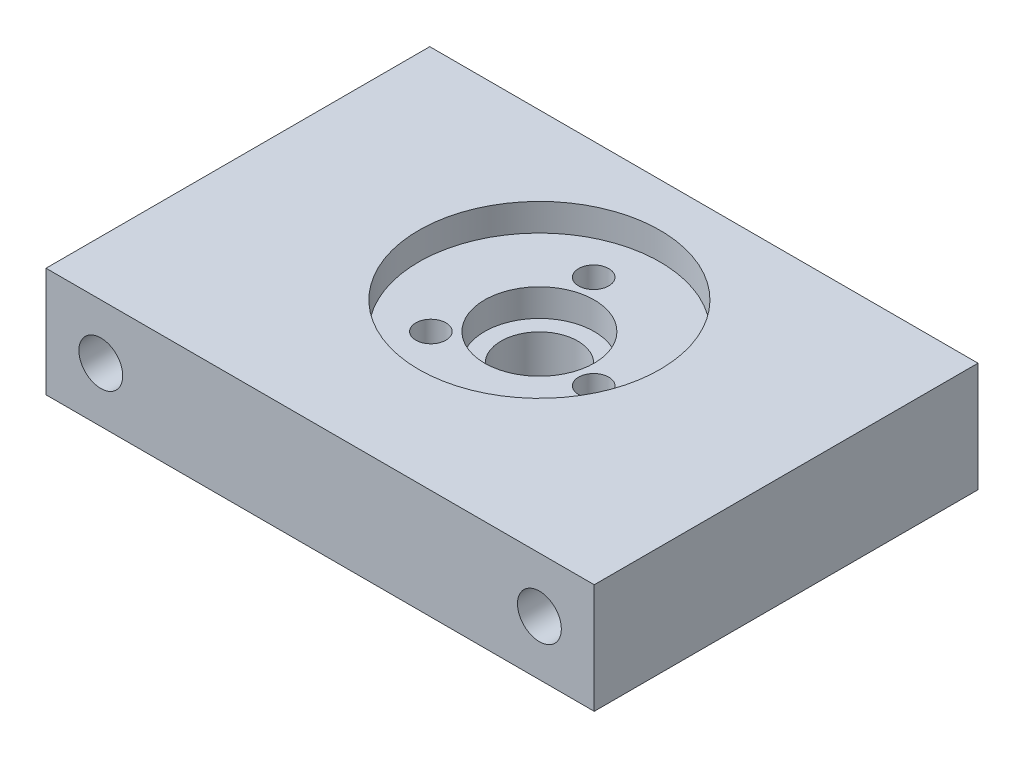
ISO-10303-21;
HEADER;
FILE_DESCRIPTION(('STEP AP214'),'2;1');
FILE_NAME('part.step','',(''),(''),'','','');
FILE_SCHEMA(('AUTOMOTIVE_DESIGN { 1 0 10303 214 1 1 1 1 }'));
ENDSEC;
DATA;
#1=APPLICATION_CONTEXT('core data for automotive mechanical design processes');
#2=APPLICATION_PROTOCOL_DEFINITION('international standard','automotive_design',2000,#1);
#3=PRODUCT_CONTEXT('',#1,'mechanical');
#4=PRODUCT('Part','Part','',(#3));
#5=PRODUCT_RELATED_PRODUCT_CATEGORY('part','',(#4));
#6=PRODUCT_DEFINITION_FORMATION('','',#4);
#7=PRODUCT_DEFINITION_CONTEXT('part definition',#1,'design');
#8=PRODUCT_DEFINITION('design','',#6,#7);
#9=PRODUCT_DEFINITION_SHAPE('','',#8);
#10=(LENGTH_UNIT() NAMED_UNIT(*) SI_UNIT(.MILLI.,.METRE.));
#11=(NAMED_UNIT(*) PLANE_ANGLE_UNIT() SI_UNIT($,.RADIAN.));
#12=(NAMED_UNIT(*) SI_UNIT($,.STERADIAN.) SOLID_ANGLE_UNIT());
#13=UNCERTAINTY_MEASURE_WITH_UNIT(LENGTH_MEASURE(1.E-05),#10,'distance_accuracy_value','');
#14=(GEOMETRIC_REPRESENTATION_CONTEXT(3) GLOBAL_UNCERTAINTY_ASSIGNED_CONTEXT((#13)) GLOBAL_UNIT_ASSIGNED_CONTEXT((#10,
#11,#12)) REPRESENTATION_CONTEXT('',''));
#15=CARTESIAN_POINT('',(0.,0.,0.));
#16=DIRECTION('',(0.,0.,1.));
#17=DIRECTION('',(1.,0.,0.));
#18=AXIS2_PLACEMENT_3D('',#15,#16,#17);
#19=CARTESIAN_POINT('',(-1.8117333157176,-5.,-9.26148078402349));
#20=DIRECTION('',(0.,1.,0.));
#21=DIRECTION('',(0.,0.,1.));
#22=AXIS2_PLACEMENT_3D('',#19,#20,#21);
#23=CYLINDRICAL_SURFACE('',#22,1.375);
#24=CARTESIAN_POINT('',(-1.8117333157176,7.5,-9.26148078402349));
#25=DIRECTION('',(0.,1.,0.));
#26=DIRECTION('',(0.,0.,1.));
#27=AXIS2_PLACEMENT_3D('',#24,#25,#26);
#28=CIRCLE('',#27,1.375);
#29=CARTESIAN_POINT('',(-1.8117333157176,7.5,-7.88648078402349));
#30=VERTEX_POINT('',#29);
#31=EDGE_CURVE('E150',#30,#30,#28,.F.);
#32=ORIENTED_EDGE('',*,*,#31,.F.);
#33=EDGE_LOOP('',(#32));
#34=FACE_BOUND('',#33,.T.);
#35=CARTESIAN_POINT('',(-1.8117333157176,2.5,-9.26148078402349));
#36=DIRECTION('',(0.,-1.,0.));
#37=DIRECTION('',(0.,0.,-1.));
#38=AXIS2_PLACEMENT_3D('',#35,#36,#37);
#39=CIRCLE('',#38,1.375);
#40=CARTESIAN_POINT('',(-1.8117333157176,2.5,-10.6364807840235));
#41=VERTEX_POINT('',#40);
#42=EDGE_CURVE('E37',#41,#41,#39,.F.);
#43=ORIENTED_EDGE('',*,*,#42,.F.);
#44=EDGE_LOOP('',(#43));
#45=FACE_BOUND('',#44,.T.);
#46=ADVANCED_FACE('F33',(#34,#45),#23,.F.);
#47=CARTESIAN_POINT('',(6.76148078402347,-5.,-0.688266684282303));
#48=DIRECTION('',(0.,1.,0.));
#49=DIRECTION('',(0.,0.,1.));
#50=AXIS2_PLACEMENT_3D('',#47,#48,#49);
#51=CYLINDRICAL_SURFACE('',#50,1.375);
#52=CARTESIAN_POINT('',(6.76148078402347,7.5,-0.688266684282303));
#53=DIRECTION('',(0.,1.,0.));
#54=DIRECTION('',(0.,0.,1.));
#55=AXIS2_PLACEMENT_3D('',#52,#53,#54);
#56=CIRCLE('',#55,1.375);
#57=CARTESIAN_POINT('',(6.76148078402347,7.5,0.686733315717693));
#58=VERTEX_POINT('',#57);
#59=EDGE_CURVE('E117',#58,#58,#56,.F.);
#60=ORIENTED_EDGE('',*,*,#59,.F.);
#61=EDGE_LOOP('',(#60));
#62=FACE_BOUND('',#61,.T.);
#63=CARTESIAN_POINT('',(6.76148078402347,2.5,-0.688266684282303));
#64=DIRECTION('',(0.,-1.,0.));
#65=DIRECTION('',(0.,0.,-1.));
#66=AXIS2_PLACEMENT_3D('',#63,#64,#65);
#67=CIRCLE('',#66,1.375);
#68=CARTESIAN_POINT('',(6.76148078402347,2.5,-2.0632666842823));
#69=VERTEX_POINT('',#68);
#70=EDGE_CURVE('E123',#69,#69,#67,.F.);
#71=ORIENTED_EDGE('',*,*,#70,.F.);
#72=EDGE_LOOP('',(#71));
#73=FACE_BOUND('',#72,.T.);
#74=ADVANCED_FACE('F187',(#62,#73),#51,.F.);
#75=CARTESIAN_POINT('',(-4.94974746830587,-5.,2.44974746830581));
#76=DIRECTION('',(0.,1.,0.));
#77=DIRECTION('',(0.,0.,1.));
#78=AXIS2_PLACEMENT_3D('',#75,#76,#77);
#79=CYLINDRICAL_SURFACE('',#78,1.375);
#80=CARTESIAN_POINT('',(-4.94974746830587,7.5,2.44974746830581));
#81=DIRECTION('',(0.,1.,0.));
#82=DIRECTION('',(0.,0.,1.));
#83=AXIS2_PLACEMENT_3D('',#80,#81,#82);
#84=CIRCLE('',#83,1.375);
#85=CARTESIAN_POINT('',(-4.94974746830587,7.5,3.82474746830581));
#86=VERTEX_POINT('',#85);
#87=EDGE_CURVE('E114',#86,#86,#84,.F.);
#88=ORIENTED_EDGE('',*,*,#87,.F.);
#89=EDGE_LOOP('',(#88));
#90=FACE_BOUND('',#89,.T.);
#91=CARTESIAN_POINT('',(-4.94974746830587,2.5,2.44974746830581));
#92=DIRECTION('',(0.,-1.,0.));
#93=DIRECTION('',(0.,0.,-1.));
#94=AXIS2_PLACEMENT_3D('',#91,#92,#93);
#95=CIRCLE('',#94,1.375);
#96=CARTESIAN_POINT('',(-4.94974746830587,2.5,1.0747474683058));
#97=VERTEX_POINT('',#96);
#98=EDGE_CURVE('E119',#97,#97,#95,.F.);
#99=ORIENTED_EDGE('',*,*,#98,.F.);
#100=EDGE_LOOP('',(#99));
#101=FACE_BOUND('',#100,.T.);
#102=ADVANCED_FACE('F165',(#90,#101),#79,.F.);
#103=CARTESIAN_POINT('',(0.,5.,-2.5));
#104=DIRECTION('',(0.,1.,0.));
#105=DIRECTION('',(0.,0.,1.));
#106=AXIS2_PLACEMENT_3D('',#103,#104,#105);
#107=CYLINDRICAL_SURFACE('',#106,5.);
#108=CARTESIAN_POINT('',(0.,5.,-2.5));
#109=DIRECTION('',(0.,1.,0.));
#110=DIRECTION('',(0.,0.,1.));
#111=AXIS2_PLACEMENT_3D('',#108,#109,#110);
#112=CIRCLE('',#111,5.);
#113=CARTESIAN_POINT('',(0.,5.,2.50000000000001));
#114=VERTEX_POINT('',#113);
#115=EDGE_CURVE('E103',#114,#114,#112,.T.);
#116=ORIENTED_EDGE('',*,*,#115,.F.);
#117=EDGE_LOOP('',(#116));
#118=FACE_BOUND('',#117,.T.);
#119=CARTESIAN_POINT('',(0.,7.5,-2.5));
#120=DIRECTION('',(0.,1.,0.));
#121=DIRECTION('',(0.,0.,1.));
#122=AXIS2_PLACEMENT_3D('',#119,#120,#121);
#123=CIRCLE('',#122,5.);
#124=CARTESIAN_POINT('',(0.,7.5,2.50000000000001));
#125=VERTEX_POINT('',#124);
#126=EDGE_CURVE('E113',#125,#125,#123,.F.);
#127=ORIENTED_EDGE('',*,*,#126,.F.);
#128=EDGE_LOOP('',(#127));
#129=FACE_BOUND('',#128,.T.);
#130=ADVANCED_FACE('F162',(#118,#129),#107,.F.);
#131=CARTESIAN_POINT('',(-25.,10.,-17.5));
#132=DIRECTION('',(1.,0.,0.));
#133=DIRECTION('',(0.,0.,-1.));
#134=AXIS2_PLACEMENT_3D('',#131,#132,#133);
#135=PLANE('',#134);
#136=DIRECTION('',(0.,0.,1.));
#137=VECTOR('',#136,1.);
#138=CARTESIAN_POINT('',(-25.,0.,-17.5));
#139=LINE('',#138,#137);
#140=CARTESIAN_POINT('',(-25.,0.,-17.5));
#141=VERTEX_POINT('',#140);
#142=CARTESIAN_POINT('',(-25.,0.,17.5));
#143=VERTEX_POINT('',#142);
#144=EDGE_CURVE('E100',#141,#143,#139,.T.);
#145=ORIENTED_EDGE('',*,*,#144,.T.);
#146=DIRECTION('',(0.,-1.,0.));
#147=VECTOR('',#146,1.);
#148=CARTESIAN_POINT('',(-25.,10.,17.5));
#149=LINE('',#148,#147);
#150=CARTESIAN_POINT('',(-25.,10.,17.5));
#151=VERTEX_POINT('',#150);
#152=EDGE_CURVE('E11',#151,#143,#149,.T.);
#153=ORIENTED_EDGE('',*,*,#152,.F.);
#154=DIRECTION('',(0.,0.,1.));
#155=VECTOR('',#154,1.);
#156=CARTESIAN_POINT('',(-25.,10.,-17.5));
#157=LINE('',#156,#155);
#158=CARTESIAN_POINT('',(-25.,10.,-17.5));
#159=VERTEX_POINT('',#158);
#160=EDGE_CURVE('E87',#159,#151,#157,.T.);
#161=ORIENTED_EDGE('',*,*,#160,.F.);
#162=DIRECTION('',(0.,-1.,0.));
#163=VECTOR('',#162,1.);
#164=CARTESIAN_POINT('',(-25.,10.,-17.5));
#165=LINE('',#164,#163);
#166=EDGE_CURVE('E96',#159,#141,#165,.T.);
#167=ORIENTED_EDGE('',*,*,#166,.T.);
#168=EDGE_LOOP('',(#145,#153,#161,#167));
#169=FACE_BOUND('',#168,.T.);
#170=ADVANCED_FACE('F35',(#169),#135,.F.);
#171=CARTESIAN_POINT('',(-25.,10.,17.5));
#172=DIRECTION('',(0.,0.,-1.));
#173=DIRECTION('',(-1.,0.,0.));
#174=AXIS2_PLACEMENT_3D('',#171,#172,#173);
#175=PLANE('',#174);
#176=CARTESIAN_POINT('',(20.,5.,17.5));
#177=DIRECTION('',(0.,0.,1.));
#178=DIRECTION('',(1.,0.,0.));
#179=AXIS2_PLACEMENT_3D('',#176,#177,#178);
#180=CIRCLE('',#179,2.00000000000001);
#181=CARTESIAN_POINT('',(22.,5.,17.5));
#182=VERTEX_POINT('',#181);
#183=EDGE_CURVE('E222',#182,#182,#180,.T.);
#184=ORIENTED_EDGE('',*,*,#183,.F.);
#185=EDGE_LOOP('',(#184));
#186=FACE_BOUND('',#185,.T.);
#187=CARTESIAN_POINT('',(-20.,5.,17.5));
#188=DIRECTION('',(0.,0.,1.));
#189=DIRECTION('',(1.,0.,0.));
#190=AXIS2_PLACEMENT_3D('',#187,#188,#189);
#191=CIRCLE('',#190,2.);
#192=CARTESIAN_POINT('',(-18.,5.,17.5));
#193=VERTEX_POINT('',#192);
#194=EDGE_CURVE('E225',#193,#193,#191,.T.);
#195=ORIENTED_EDGE('',*,*,#194,.F.);
#196=EDGE_LOOP('',(#195));
#197=FACE_BOUND('',#196,.T.);
#198=DIRECTION('',(1.,0.,0.));
#199=VECTOR('',#198,1.);
#200=CARTESIAN_POINT('',(-25.,0.,17.5));
#201=LINE('',#200,#199);
#202=CARTESIAN_POINT('',(25.,0.,17.5));
#203=VERTEX_POINT('',#202);
#204=EDGE_CURVE('E91',#143,#203,#201,.T.);
#205=ORIENTED_EDGE('',*,*,#204,.T.);
#206=DIRECTION('',(0.,-1.,0.));
#207=VECTOR('',#206,1.);
#208=CARTESIAN_POINT('',(25.,10.,17.5));
#209=LINE('',#208,#207);
#210=CARTESIAN_POINT('',(25.,10.,17.5));
#211=VERTEX_POINT('',#210);
#212=EDGE_CURVE('E43',#211,#203,#209,.T.);
#213=ORIENTED_EDGE('',*,*,#212,.F.);
#214=DIRECTION('',(1.,0.,0.));
#215=VECTOR('',#214,1.);
#216=CARTESIAN_POINT('',(-25.,10.,17.5));
#217=LINE('',#216,#215);
#218=EDGE_CURVE('E82',#151,#211,#217,.T.);
#219=ORIENTED_EDGE('',*,*,#218,.F.);
#220=ORIENTED_EDGE('',*,*,#152,.T.);
#221=EDGE_LOOP('',(#205,#213,#219,#220));
#222=FACE_BOUND('',#221,.T.);
#223=ADVANCED_FACE('F90',(#186,#197,#222),#175,.F.);
#224=CARTESIAN_POINT('',(25.,10.,-17.5));
#225=DIRECTION('',(-1.,0.,0.));
#226=DIRECTION('',(0.,0.,1.));
#227=AXIS2_PLACEMENT_3D('',#224,#225,#226);
#228=PLANE('',#227);
#229=DIRECTION('',(0.,0.,-1.));
#230=VECTOR('',#229,1.);
#231=CARTESIAN_POINT('',(25.,0.,-17.5));
#232=LINE('',#231,#230);
#233=CARTESIAN_POINT('',(25.,0.,-17.5));
#234=VERTEX_POINT('',#233);
#235=EDGE_CURVE('E69',#203,#234,#232,.T.);
#236=ORIENTED_EDGE('',*,*,#235,.T.);
#237=DIRECTION('',(0.,-1.,0.));
#238=VECTOR('',#237,1.);
#239=CARTESIAN_POINT('',(25.,10.,-17.5));
#240=LINE('',#239,#238);
#241=CARTESIAN_POINT('',(25.,10.,-17.5));
#242=VERTEX_POINT('',#241);
#243=EDGE_CURVE('E92',#242,#234,#240,.T.);
#244=ORIENTED_EDGE('',*,*,#243,.F.);
#245=DIRECTION('',(0.,0.,-1.));
#246=VECTOR('',#245,1.);
#247=CARTESIAN_POINT('',(25.,10.,-17.5));
#248=LINE('',#247,#246);
#249=EDGE_CURVE('E85',#211,#242,#248,.T.);
#250=ORIENTED_EDGE('',*,*,#249,.F.);
#251=ORIENTED_EDGE('',*,*,#212,.T.);
#252=EDGE_LOOP('',(#236,#244,#250,#251));
#253=FACE_BOUND('',#252,.T.);
#254=ADVANCED_FACE('F94',(#253),#228,.F.);
#255=CARTESIAN_POINT('',(-25.,10.,-17.5));
#256=DIRECTION('',(0.,0.,1.));
#257=DIRECTION('',(1.,0.,0.));
#258=AXIS2_PLACEMENT_3D('',#255,#256,#257);
#259=PLANE('',#258);
#260=DIRECTION('',(-1.,0.,0.));
#261=VECTOR('',#260,1.);
#262=CARTESIAN_POINT('',(-25.,0.,-17.5));
#263=LINE('',#262,#261);
#264=EDGE_CURVE('E75',#234,#141,#263,.T.);
#265=ORIENTED_EDGE('',*,*,#264,.T.);
#266=ORIENTED_EDGE('',*,*,#166,.F.);
#267=DIRECTION('',(-1.,0.,0.));
#268=VECTOR('',#267,1.);
#269=CARTESIAN_POINT('',(-25.,10.,-17.5));
#270=LINE('',#269,#268);
#271=EDGE_CURVE('E52',#242,#159,#270,.T.);
#272=ORIENTED_EDGE('',*,*,#271,.F.);
#273=ORIENTED_EDGE('',*,*,#243,.T.);
#274=EDGE_LOOP('',(#265,#266,#272,#273));
#275=FACE_BOUND('',#274,.T.);
#276=ADVANCED_FACE('F205',(#275),#259,.F.);
#277=CARTESIAN_POINT('',(0.,10.,0.));
#278=DIRECTION('',(0.,1.,0.));
#279=DIRECTION('',(0.,0.,1.));
#280=AXIS2_PLACEMENT_3D('',#277,#278,#279);
#281=PLANE('',#280);
#282=CARTESIAN_POINT('',(0.,10.,-2.5));
#283=DIRECTION('',(0.,1.,0.));
#284=DIRECTION('',(0.,0.,1.));
#285=AXIS2_PLACEMENT_3D('',#282,#283,#284);
#286=CIRCLE('',#285,11.);
#287=CARTESIAN_POINT('',(0.,10.,8.5));
#288=VERTEX_POINT('',#287);
#289=EDGE_CURVE('E121',#288,#288,#286,.T.);
#290=ORIENTED_EDGE('',*,*,#289,.F.);
#291=EDGE_LOOP('',(#290));
#292=FACE_BOUND('',#291,.T.);
#293=ORIENTED_EDGE('',*,*,#160,.T.);
#294=ORIENTED_EDGE('',*,*,#218,.T.);
#295=ORIENTED_EDGE('',*,*,#249,.T.);
#296=ORIENTED_EDGE('',*,*,#271,.T.);
#297=EDGE_LOOP('',(#293,#294,#295,#296));
#298=FACE_BOUND('',#297,.T.);
#299=ADVANCED_FACE('F83',(#292,#298),#281,.T.);
#300=CARTESIAN_POINT('',(0.,0.,0.));
#301=DIRECTION('',(0.,1.,0.));
#302=DIRECTION('',(0.,0.,1.));
#303=AXIS2_PLACEMENT_3D('',#300,#301,#302);
#304=PLANE('',#303);
#305=CARTESIAN_POINT('',(-1.8117333157176,0.,-9.26148078402349));
#306=DIRECTION('',(0.,-1.,0.));
#307=DIRECTION('',(0.,0.,-1.));
#308=AXIS2_PLACEMENT_3D('',#305,#306,#307);
#309=CIRCLE('',#308,2.25);
#310=CARTESIAN_POINT('',(-1.8117333157176,0.,-11.5114807840235));
#311=VERTEX_POINT('',#310);
#312=EDGE_CURVE('E139',#311,#311,#309,.T.);
#313=ORIENTED_EDGE('',*,*,#312,.F.);
#314=EDGE_LOOP('',(#313));
#315=FACE_BOUND('',#314,.T.);
#316=CARTESIAN_POINT('',(6.76148078402347,0.,-0.688266684282303));
#317=DIRECTION('',(0.,-1.,0.));
#318=DIRECTION('',(0.,0.,-1.));
#319=AXIS2_PLACEMENT_3D('',#316,#317,#318);
#320=CIRCLE('',#319,2.25);
#321=CARTESIAN_POINT('',(6.76148078402347,0.,-2.9382666842823));
#322=VERTEX_POINT('',#321);
#323=EDGE_CURVE('E132',#322,#322,#320,.T.);
#324=ORIENTED_EDGE('',*,*,#323,.F.);
#325=EDGE_LOOP('',(#324));
#326=FACE_BOUND('',#325,.T.);
#327=CARTESIAN_POINT('',(-4.94974746830587,0.,2.44974746830581));
#328=DIRECTION('',(0.,-1.,0.));
#329=DIRECTION('',(0.,0.,-1.));
#330=AXIS2_PLACEMENT_3D('',#327,#328,#329);
#331=CIRCLE('',#330,2.25);
#332=CARTESIAN_POINT('',(-4.94974746830587,0.,0.199747468305805));
#333=VERTEX_POINT('',#332);
#334=EDGE_CURVE('E125',#333,#333,#331,.T.);
#335=ORIENTED_EDGE('',*,*,#334,.F.);
#336=EDGE_LOOP('',(#335));
#337=FACE_BOUND('',#336,.T.);
#338=CARTESIAN_POINT('',(0.,0.,-2.5));
#339=DIRECTION('',(0.,1.,0.));
#340=DIRECTION('',(0.,0.,1.));
#341=AXIS2_PLACEMENT_3D('',#338,#339,#340);
#342=CIRCLE('',#341,3.5);
#343=CARTESIAN_POINT('',(0.,0.,1.));
#344=VERTEX_POINT('',#343);
#345=EDGE_CURVE('E112',#344,#344,#342,.T.);
#346=ORIENTED_EDGE('',*,*,#345,.T.);
#347=EDGE_LOOP('',(#346));
#348=FACE_BOUND('',#347,.T.);
#349=ORIENTED_EDGE('',*,*,#144,.F.);
#350=ORIENTED_EDGE('',*,*,#264,.F.);
#351=ORIENTED_EDGE('',*,*,#235,.F.);
#352=ORIENTED_EDGE('',*,*,#204,.F.);
#353=EDGE_LOOP('',(#349,#350,#351,#352));
#354=FACE_BOUND('',#353,.T.);
#355=ADVANCED_FACE('F200',(#315,#326,#337,#348,#354),#304,.F.);
#356=CARTESIAN_POINT('',(0.,5.,-2.5));
#357=DIRECTION('',(0.,1.,0.));
#358=DIRECTION('',(0.,0.,1.));
#359=AXIS2_PLACEMENT_3D('',#356,#357,#358);
#360=PLANE('',#359);
#361=CARTESIAN_POINT('',(0.,5.,-2.5));
#362=DIRECTION('',(0.,1.,0.));
#363=DIRECTION('',(0.,0.,1.));
#364=AXIS2_PLACEMENT_3D('',#361,#362,#363);
#365=CIRCLE('',#364,3.5);
#366=CARTESIAN_POINT('',(0.,5.,1.));
#367=VERTEX_POINT('',#366);
#368=EDGE_CURVE('E109',#367,#367,#365,.T.);
#369=ORIENTED_EDGE('',*,*,#368,.F.);
#370=EDGE_LOOP('',(#369));
#371=FACE_BOUND('',#370,.T.);
#372=ORIENTED_EDGE('',*,*,#115,.T.);
#373=EDGE_LOOP('',(#372));
#374=FACE_BOUND('',#373,.T.);
#375=ADVANCED_FACE('F160',(#371,#374),#360,.T.);
#376=CARTESIAN_POINT('',(0.,-5.,-2.5));
#377=DIRECTION('',(0.,1.,0.));
#378=DIRECTION('',(0.,0.,1.));
#379=AXIS2_PLACEMENT_3D('',#376,#377,#378);
#380=CYLINDRICAL_SURFACE('',#379,3.5);
#381=ORIENTED_EDGE('',*,*,#368,.T.);
#382=EDGE_LOOP('',(#381));
#383=FACE_BOUND('',#382,.T.);
#384=ORIENTED_EDGE('',*,*,#345,.F.);
#385=EDGE_LOOP('',(#384));
#386=FACE_BOUND('',#385,.T.);
#387=ADVANCED_FACE('F172',(#383,#386),#380,.F.);
#388=CARTESIAN_POINT('',(0.,7.5,-2.5));
#389=DIRECTION('',(0.,1.,0.));
#390=DIRECTION('',(0.,0.,1.));
#391=AXIS2_PLACEMENT_3D('',#388,#389,#390);
#392=PLANE('',#391);
#393=ORIENTED_EDGE('',*,*,#31,.T.);
#394=EDGE_LOOP('',(#393));
#395=FACE_BOUND('',#394,.T.);
#396=ORIENTED_EDGE('',*,*,#87,.T.);
#397=EDGE_LOOP('',(#396));
#398=FACE_BOUND('',#397,.T.);
#399=CARTESIAN_POINT('',(0.,7.5,-2.5));
#400=DIRECTION('',(0.,1.,0.));
#401=DIRECTION('',(0.,0.,1.));
#402=AXIS2_PLACEMENT_3D('',#399,#400,#401);
#403=CIRCLE('',#402,11.);
#404=CARTESIAN_POINT('',(0.,7.5,8.5));
#405=VERTEX_POINT('',#404);
#406=EDGE_CURVE('E118',#405,#405,#403,.T.);
#407=ORIENTED_EDGE('',*,*,#406,.T.);
#408=EDGE_LOOP('',(#407));
#409=FACE_BOUND('',#408,.T.);
#410=ORIENTED_EDGE('',*,*,#59,.T.);
#411=EDGE_LOOP('',(#410));
#412=FACE_BOUND('',#411,.T.);
#413=ORIENTED_EDGE('',*,*,#126,.T.);
#414=EDGE_LOOP('',(#413));
#415=FACE_BOUND('',#414,.T.);
#416=ADVANCED_FACE('F169',(#395,#398,#409,#412,#415),#392,.T.);
#417=CARTESIAN_POINT('',(0.,7.5,-2.5));
#418=DIRECTION('',(0.,1.,0.));
#419=DIRECTION('',(0.,0.,1.));
#420=AXIS2_PLACEMENT_3D('',#417,#418,#419);
#421=CYLINDRICAL_SURFACE('',#420,11.);
#422=ORIENTED_EDGE('',*,*,#406,.F.);
#423=EDGE_LOOP('',(#422));
#424=FACE_BOUND('',#423,.T.);
#425=ORIENTED_EDGE('',*,*,#289,.T.);
#426=EDGE_LOOP('',(#425));
#427=FACE_BOUND('',#426,.T.);
#428=ADVANCED_FACE('F171',(#424,#427),#421,.F.);
#429=CARTESIAN_POINT('',(-4.94974746830587,2.5,2.44974746830581));
#430=DIRECTION('',(0.,-1.,0.));
#431=DIRECTION('',(0.,0.,-1.));
#432=AXIS2_PLACEMENT_3D('',#429,#430,#431);
#433=PLANE('',#432);
#434=CARTESIAN_POINT('',(-4.94974746830587,2.5,2.44974746830581));
#435=DIRECTION('',(0.,-1.,0.));
#436=DIRECTION('',(0.,0.,-1.));
#437=AXIS2_PLACEMENT_3D('',#434,#435,#436);
#438=CIRCLE('',#437,2.25);
#439=CARTESIAN_POINT('',(-4.94974746830587,2.5,0.199747468305805));
#440=VERTEX_POINT('',#439);
#441=EDGE_CURVE('E122',#440,#440,#438,.T.);
#442=ORIENTED_EDGE('',*,*,#441,.T.);
#443=EDGE_LOOP('',(#442));
#444=FACE_BOUND('',#443,.T.);
#445=ORIENTED_EDGE('',*,*,#98,.T.);
#446=EDGE_LOOP('',(#445));
#447=FACE_BOUND('',#446,.T.);
#448=ADVANCED_FACE('F179',(#444,#447),#433,.T.);
#449=CARTESIAN_POINT('',(-4.94974746830587,2.5,2.44974746830581));
#450=DIRECTION('',(0.,-1.,0.));
#451=DIRECTION('',(0.,0.,-1.));
#452=AXIS2_PLACEMENT_3D('',#449,#450,#451);
#453=CYLINDRICAL_SURFACE('',#452,2.25);
#454=ORIENTED_EDGE('',*,*,#441,.F.);
#455=EDGE_LOOP('',(#454));
#456=FACE_BOUND('',#455,.T.);
#457=ORIENTED_EDGE('',*,*,#334,.T.);
#458=EDGE_LOOP('',(#457));
#459=FACE_BOUND('',#458,.T.);
#460=ADVANCED_FACE('F254',(#456,#459),#453,.F.);
#461=CARTESIAN_POINT('',(6.76148078402347,2.5,-0.688266684282303));
#462=DIRECTION('',(0.,-1.,0.));
#463=DIRECTION('',(0.,0.,-1.));
#464=AXIS2_PLACEMENT_3D('',#461,#462,#463);
#465=PLANE('',#464);
#466=CARTESIAN_POINT('',(6.76148078402347,2.5,-0.688266684282303));
#467=DIRECTION('',(0.,-1.,0.));
#468=DIRECTION('',(0.,0.,-1.));
#469=AXIS2_PLACEMENT_3D('',#466,#467,#468);
#470=CIRCLE('',#469,2.25);
#471=CARTESIAN_POINT('',(6.76148078402347,2.5,-2.9382666842823));
#472=VERTEX_POINT('',#471);
#473=EDGE_CURVE('E126',#472,#472,#470,.T.);
#474=ORIENTED_EDGE('',*,*,#473,.T.);
#475=EDGE_LOOP('',(#474));
#476=FACE_BOUND('',#475,.T.);
#477=ORIENTED_EDGE('',*,*,#70,.T.);
#478=EDGE_LOOP('',(#477));
#479=FACE_BOUND('',#478,.T.);
#480=ADVANCED_FACE('F256',(#476,#479),#465,.T.);
#481=CARTESIAN_POINT('',(6.76148078402347,2.5,-0.688266684282303));
#482=DIRECTION('',(0.,-1.,0.));
#483=DIRECTION('',(0.,0.,-1.));
#484=AXIS2_PLACEMENT_3D('',#481,#482,#483);
#485=CYLINDRICAL_SURFACE('',#484,2.25);
#486=ORIENTED_EDGE('',*,*,#473,.F.);
#487=EDGE_LOOP('',(#486));
#488=FACE_BOUND('',#487,.T.);
#489=ORIENTED_EDGE('',*,*,#323,.T.);
#490=EDGE_LOOP('',(#489));
#491=FACE_BOUND('',#490,.T.);
#492=ADVANCED_FACE('F262',(#488,#491),#485,.F.);
#493=CARTESIAN_POINT('',(-1.8117333157176,2.5,-9.26148078402349));
#494=DIRECTION('',(0.,-1.,0.));
#495=DIRECTION('',(0.,0.,-1.));
#496=AXIS2_PLACEMENT_3D('',#493,#494,#495);
#497=PLANE('',#496);
#498=CARTESIAN_POINT('',(-1.8117333157176,2.5,-9.26148078402349));
#499=DIRECTION('',(0.,-1.,0.));
#500=DIRECTION('',(0.,0.,-1.));
#501=AXIS2_PLACEMENT_3D('',#498,#499,#500);
#502=CIRCLE('',#501,2.25);
#503=CARTESIAN_POINT('',(-1.8117333157176,2.5,-11.5114807840235));
#504=VERTEX_POINT('',#503);
#505=EDGE_CURVE('E235',#504,#504,#502,.T.);
#506=ORIENTED_EDGE('',*,*,#505,.T.);
#507=EDGE_LOOP('',(#506));
#508=FACE_BOUND('',#507,.T.);
#509=ORIENTED_EDGE('',*,*,#42,.T.);
#510=EDGE_LOOP('',(#509));
#511=FACE_BOUND('',#510,.T.);
#512=ADVANCED_FACE('F269',(#508,#511),#497,.T.);
#513=CARTESIAN_POINT('',(-1.8117333157176,2.5,-9.26148078402349));
#514=DIRECTION('',(0.,-1.,0.));
#515=DIRECTION('',(0.,0.,-1.));
#516=AXIS2_PLACEMENT_3D('',#513,#514,#515);
#517=CYLINDRICAL_SURFACE('',#516,2.25);
#518=ORIENTED_EDGE('',*,*,#505,.F.);
#519=EDGE_LOOP('',(#518));
#520=FACE_BOUND('',#519,.T.);
#521=ORIENTED_EDGE('',*,*,#312,.T.);
#522=EDGE_LOOP('',(#521));
#523=FACE_BOUND('',#522,.T.);
#524=ADVANCED_FACE('F243',(#520,#523),#517,.F.);
#525=CARTESIAN_POINT('',(-20.,5.,7.5));
#526=DIRECTION('',(0.,0.,1.));
#527=DIRECTION('',(1.,0.,0.));
#528=AXIS2_PLACEMENT_3D('',#525,#526,#527);
#529=CYLINDRICAL_SURFACE('',#528,2.);
#530=CARTESIAN_POINT('',(-20.,5.,7.5));
#531=DIRECTION('',(0.,0.,1.));
#532=DIRECTION('',(1.,0.,0.));
#533=AXIS2_PLACEMENT_3D('',#530,#531,#532);
#534=CIRCLE('',#533,2.);
#535=CARTESIAN_POINT('',(-18.,5.,7.5));
#536=VERTEX_POINT('',#535);
#537=EDGE_CURVE('E227',#536,#536,#534,.T.);
#538=ORIENTED_EDGE('',*,*,#537,.F.);
#539=EDGE_LOOP('',(#538));
#540=FACE_BOUND('',#539,.T.);
#541=ORIENTED_EDGE('',*,*,#194,.T.);
#542=EDGE_LOOP('',(#541));
#543=FACE_BOUND('',#542,.T.);
#544=ADVANCED_FACE('F274',(#540,#543),#529,.F.);
#545=CARTESIAN_POINT('',(-20.,5.,7.5));
#546=DIRECTION('',(0.,0.,1.));
#547=DIRECTION('',(1.,0.,0.));
#548=AXIS2_PLACEMENT_3D('',#545,#546,#547);
#549=PLANE('',#548);
#550=ORIENTED_EDGE('',*,*,#537,.T.);
#551=EDGE_LOOP('',(#550));
#552=FACE_BOUND('',#551,.T.);
#553=ADVANCED_FACE('F280',(#552),#549,.T.);
#554=CARTESIAN_POINT('',(20.,5.,7.5));
#555=DIRECTION('',(0.,0.,1.));
#556=DIRECTION('',(1.,0.,0.));
#557=AXIS2_PLACEMENT_3D('',#554,#555,#556);
#558=CYLINDRICAL_SURFACE('',#557,2.00000000000001);
#559=CARTESIAN_POINT('',(20.,5.,7.5));
#560=DIRECTION('',(0.,0.,1.));
#561=DIRECTION('',(1.,0.,0.));
#562=AXIS2_PLACEMENT_3D('',#559,#560,#561);
#563=CIRCLE('',#562,2.00000000000001);
#564=CARTESIAN_POINT('',(22.,5.,7.5));
#565=VERTEX_POINT('',#564);
#566=EDGE_CURVE('E228',#565,#565,#563,.T.);
#567=ORIENTED_EDGE('',*,*,#566,.F.);
#568=EDGE_LOOP('',(#567));
#569=FACE_BOUND('',#568,.T.);
#570=ORIENTED_EDGE('',*,*,#183,.T.);
#571=EDGE_LOOP('',(#570));
#572=FACE_BOUND('',#571,.T.);
#573=ADVANCED_FACE('F284',(#569,#572),#558,.F.);
#574=CARTESIAN_POINT('',(20.,5.,7.5));
#575=DIRECTION('',(0.,0.,1.));
#576=DIRECTION('',(1.,0.,0.));
#577=AXIS2_PLACEMENT_3D('',#574,#575,#576);
#578=PLANE('',#577);
#579=ORIENTED_EDGE('',*,*,#566,.T.);
#580=EDGE_LOOP('',(#579));
#581=FACE_BOUND('',#580,.T.);
#582=ADVANCED_FACE('F288',(#581),#578,.T.);
#583=CLOSED_SHELL('',(#46,#74,#102,#130,#170,#223,#254,#276,#299,#355,#375,#387,#416,#428,#448,
#460,#480,#492,#512,#524,#544,#553,#573,#582));
#584=MANIFOLD_SOLID_BREP('B2',#583);
#585=ADVANCED_BREP_SHAPE_REPRESENTATION('',(#18,#584),#14);
#586=SHAPE_DEFINITION_REPRESENTATION(#9,#585);
ENDSEC;
END-ISO-10303-21;
